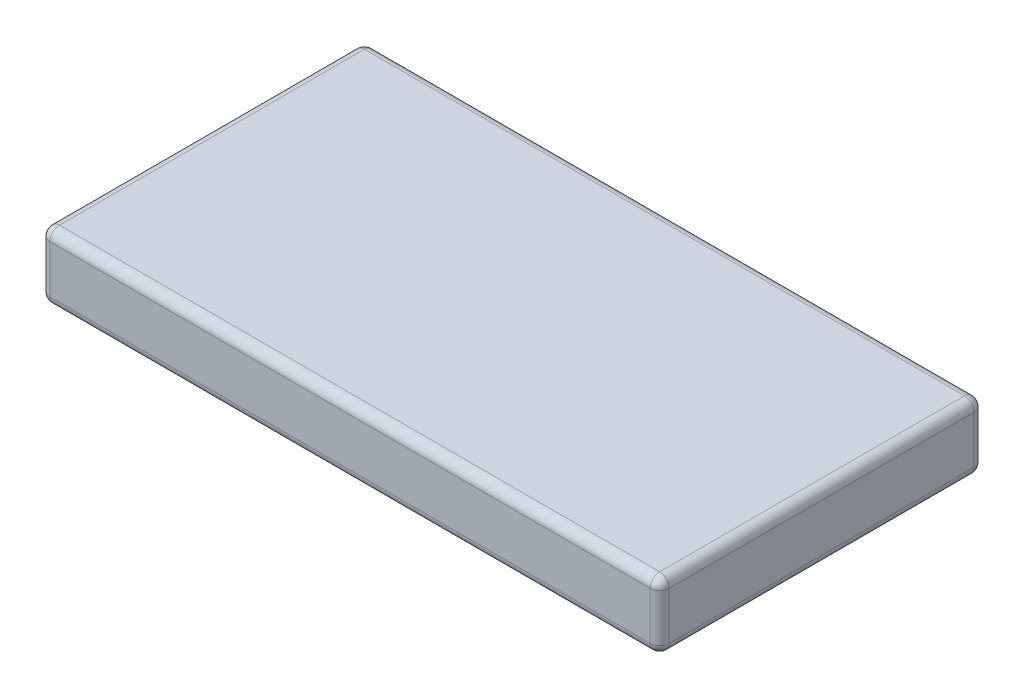
ISO-10303-21;
HEADER;
FILE_DESCRIPTION(('STEP AP214'),'2;1');
FILE_NAME('part.step','',(''),(''),'','','');
FILE_SCHEMA(('AUTOMOTIVE_DESIGN { 1 0 10303 214 1 1 1 1 }'));
ENDSEC;
DATA;
#1=APPLICATION_CONTEXT('core data for automotive mechanical design processes');
#2=APPLICATION_PROTOCOL_DEFINITION('international standard','automotive_design',2000,#1);
#3=PRODUCT_CONTEXT('',#1,'mechanical');
#4=PRODUCT('Part','Part','',(#3));
#5=PRODUCT_RELATED_PRODUCT_CATEGORY('part','',(#4));
#6=PRODUCT_DEFINITION_FORMATION('','',#4);
#7=PRODUCT_DEFINITION_CONTEXT('part definition',#1,'design');
#8=PRODUCT_DEFINITION('design','',#6,#7);
#9=PRODUCT_DEFINITION_SHAPE('','',#8);
#10=(LENGTH_UNIT() NAMED_UNIT(*) SI_UNIT(.MILLI.,.METRE.));
#11=(NAMED_UNIT(*) PLANE_ANGLE_UNIT() SI_UNIT($,.RADIAN.));
#12=(NAMED_UNIT(*) SI_UNIT($,.STERADIAN.) SOLID_ANGLE_UNIT());
#13=UNCERTAINTY_MEASURE_WITH_UNIT(LENGTH_MEASURE(1.E-05),#10,'distance_accuracy_value','');
#14=(GEOMETRIC_REPRESENTATION_CONTEXT(3) GLOBAL_UNCERTAINTY_ASSIGNED_CONTEXT((#13)) GLOBAL_UNIT_ASSIGNED_CONTEXT((#10,
#11,#12)) REPRESENTATION_CONTEXT('',''));
#15=CARTESIAN_POINT('',(0.,0.,0.));
#16=DIRECTION('',(0.,0.,1.));
#17=DIRECTION('',(1.,0.,0.));
#18=AXIS2_PLACEMENT_3D('',#15,#16,#17);
#19=CARTESIAN_POINT('',(32.5,7.,-17.));
#20=DIRECTION('',(-1.,0.,0.));
#21=DIRECTION('',(0.,0.,1.));
#22=AXIS2_PLACEMENT_3D('',#19,#20,#21);
#23=PLANE('',#22);
#24=DIRECTION('',(0.,0.,-1.));
#25=VECTOR('',#24,1.);
#26=CARTESIAN_POINT('',(32.5,1.,-17.));
#27=LINE('',#26,#25);
#28=CARTESIAN_POINT('',(32.5,1.,16.));
#29=VERTEX_POINT('',#28);
#30=CARTESIAN_POINT('',(32.5,1.,-16.));
#31=VERTEX_POINT('',#30);
#32=EDGE_CURVE('E168',#29,#31,#27,.T.);
#33=ORIENTED_EDGE('',*,*,#32,.T.);
#34=DIRECTION('',(0.,-1.,0.));
#35=VECTOR('',#34,1.);
#36=CARTESIAN_POINT('',(32.5,7.,-16.));
#37=LINE('',#36,#35);
#38=CARTESIAN_POINT('',(32.5,6.,-16.));
#39=VERTEX_POINT('',#38);
#40=EDGE_CURVE('E174',#31,#39,#37,.F.);
#41=ORIENTED_EDGE('',*,*,#40,.T.);
#42=DIRECTION('',(0.,0.,-1.));
#43=VECTOR('',#42,1.);
#44=CARTESIAN_POINT('',(32.5,6.,17.));
#45=LINE('',#44,#43);
#46=CARTESIAN_POINT('',(32.5,6.,16.));
#47=VERTEX_POINT('',#46);
#48=EDGE_CURVE('E172',#39,#47,#45,.F.);
#49=ORIENTED_EDGE('',*,*,#48,.T.);
#50=DIRECTION('',(0.,-1.,0.));
#51=VECTOR('',#50,1.);
#52=CARTESIAN_POINT('',(32.5,7.,16.));
#53=LINE('',#52,#51);
#54=EDGE_CURVE('E170',#47,#29,#53,.T.);
#55=ORIENTED_EDGE('',*,*,#54,.T.);
#56=EDGE_LOOP('',(#33,#41,#49,#55));
#57=FACE_BOUND('',#56,.T.);
#58=ADVANCED_FACE('F34',(#57),#23,.F.);
#59=CARTESIAN_POINT('',(-32.5,7.,-17.));
#60=DIRECTION('',(0.,0.,1.));
#61=DIRECTION('',(1.,0.,0.));
#62=AXIS2_PLACEMENT_3D('',#59,#60,#61);
#63=PLANE('',#62);
#64=DIRECTION('',(0.,-1.,0.));
#65=VECTOR('',#64,1.);
#66=CARTESIAN_POINT('',(-31.5,7.,-17.));
#67=LINE('',#66,#65);
#68=CARTESIAN_POINT('',(-31.5,1.,-17.));
#69=VERTEX_POINT('',#68);
#70=CARTESIAN_POINT('',(-31.5,6.,-17.));
#71=VERTEX_POINT('',#70);
#72=EDGE_CURVE('E130',#69,#71,#67,.F.);
#73=ORIENTED_EDGE('',*,*,#72,.T.);
#74=DIRECTION('',(-1.,0.,0.));
#75=VECTOR('',#74,1.);
#76=CARTESIAN_POINT('',(32.5,6.,-17.));
#77=LINE('',#76,#75);
#78=CARTESIAN_POINT('',(31.5,6.,-17.));
#79=VERTEX_POINT('',#78);
#80=EDGE_CURVE('E166',#71,#79,#77,.F.);
#81=ORIENTED_EDGE('',*,*,#80,.T.);
#82=DIRECTION('',(0.,-1.,0.));
#83=VECTOR('',#82,1.);
#84=CARTESIAN_POINT('',(31.5,7.,-17.));
#85=LINE('',#84,#83);
#86=CARTESIAN_POINT('',(31.5,1.,-17.));
#87=VERTEX_POINT('',#86);
#88=EDGE_CURVE('E159',#79,#87,#85,.T.);
#89=ORIENTED_EDGE('',*,*,#88,.T.);
#90=DIRECTION('',(-1.,0.,0.));
#91=VECTOR('',#90,1.);
#92=CARTESIAN_POINT('',(-32.5,1.,-17.));
#93=LINE('',#92,#91);
#94=EDGE_CURVE('E157',#87,#69,#93,.T.);
#95=ORIENTED_EDGE('',*,*,#94,.T.);
#96=EDGE_LOOP('',(#73,#81,#89,#95));
#97=FACE_BOUND('',#96,.T.);
#98=ADVANCED_FACE('F331',(#97),#63,.F.);
#99=CARTESIAN_POINT('',(-32.5,7.,-17.));
#100=DIRECTION('',(1.,0.,0.));
#101=DIRECTION('',(0.,0.,-1.));
#102=AXIS2_PLACEMENT_3D('',#99,#100,#101);
#103=PLANE('',#102);
#104=DIRECTION('',(0.,0.,1.));
#105=VECTOR('',#104,1.);
#106=CARTESIAN_POINT('',(-32.5,6.,-17.));
#107=LINE('',#106,#105);
#108=CARTESIAN_POINT('',(-32.5,6.,16.));
#109=VERTEX_POINT('',#108);
#110=CARTESIAN_POINT('',(-32.5,6.,-16.));
#111=VERTEX_POINT('',#110);
#112=EDGE_CURVE('E155',#109,#111,#107,.F.);
#113=ORIENTED_EDGE('',*,*,#112,.T.);
#114=DIRECTION('',(0.,-1.,0.));
#115=VECTOR('',#114,1.);
#116=CARTESIAN_POINT('',(-32.5,7.,-16.));
#117=LINE('',#116,#115);
#118=CARTESIAN_POINT('',(-32.5,1.,-16.));
#119=VERTEX_POINT('',#118);
#120=EDGE_CURVE('E128',#111,#119,#117,.T.);
#121=ORIENTED_EDGE('',*,*,#120,.T.);
#122=DIRECTION('',(0.,0.,1.));
#123=VECTOR('',#122,1.);
#124=CARTESIAN_POINT('',(-32.5,1.,-17.));
#125=LINE('',#124,#123);
#126=CARTESIAN_POINT('',(-32.5,1.,16.));
#127=VERTEX_POINT('',#126);
#128=EDGE_CURVE('E145',#119,#127,#125,.T.);
#129=ORIENTED_EDGE('',*,*,#128,.T.);
#130=DIRECTION('',(0.,-1.,0.));
#131=VECTOR('',#130,1.);
#132=CARTESIAN_POINT('',(-32.5,7.,16.));
#133=LINE('',#132,#131);
#134=EDGE_CURVE('E151',#127,#109,#133,.F.);
#135=ORIENTED_EDGE('',*,*,#134,.T.);
#136=EDGE_LOOP('',(#113,#121,#129,#135));
#137=FACE_BOUND('',#136,.T.);
#138=ADVANCED_FACE('F153',(#137),#103,.F.);
#139=CARTESIAN_POINT('',(-32.5,7.,17.));
#140=DIRECTION('',(0.,0.,-1.));
#141=DIRECTION('',(-1.,0.,0.));
#142=AXIS2_PLACEMENT_3D('',#139,#140,#141);
#143=PLANE('',#142);
#144=DIRECTION('',(1.,0.,0.));
#145=VECTOR('',#144,1.);
#146=CARTESIAN_POINT('',(-32.5,6.,17.));
#147=LINE('',#146,#145);
#148=CARTESIAN_POINT('',(31.5,6.,17.));
#149=VERTEX_POINT('',#148);
#150=CARTESIAN_POINT('',(-31.5,6.,17.));
#151=VERTEX_POINT('',#150);
#152=EDGE_CURVE('E192',#149,#151,#147,.F.);
#153=ORIENTED_EDGE('',*,*,#152,.T.);
#154=DIRECTION('',(0.,-1.,0.));
#155=VECTOR('',#154,1.);
#156=CARTESIAN_POINT('',(-31.5,7.,17.));
#157=LINE('',#156,#155);
#158=CARTESIAN_POINT('',(-31.5,1.,17.));
#159=VERTEX_POINT('',#158);
#160=EDGE_CURVE('E195',#151,#159,#157,.T.);
#161=ORIENTED_EDGE('',*,*,#160,.T.);
#162=DIRECTION('',(1.,0.,0.));
#163=VECTOR('',#162,1.);
#164=CARTESIAN_POINT('',(-32.5,1.,17.));
#165=LINE('',#164,#163);
#166=CARTESIAN_POINT('',(31.5,1.,17.));
#167=VERTEX_POINT('',#166);
#168=EDGE_CURVE('E187',#159,#167,#165,.T.);
#169=ORIENTED_EDGE('',*,*,#168,.T.);
#170=DIRECTION('',(0.,-1.,0.));
#171=VECTOR('',#170,1.);
#172=CARTESIAN_POINT('',(31.5,7.,17.));
#173=LINE('',#172,#171);
#174=EDGE_CURVE('E190',#167,#149,#173,.F.);
#175=ORIENTED_EDGE('',*,*,#174,.T.);
#176=EDGE_LOOP('',(#153,#161,#169,#175));
#177=FACE_BOUND('',#176,.T.);
#178=ADVANCED_FACE('F283',(#177),#143,.F.);
#179=CARTESIAN_POINT('',(0.,7.,0.));
#180=DIRECTION('',(0.,1.,0.));
#181=DIRECTION('',(0.,0.,1.));
#182=AXIS2_PLACEMENT_3D('',#179,#180,#181);
#183=PLANE('',#182);
#184=DIRECTION('',(-1.,0.,0.));
#185=VECTOR('',#184,1.);
#186=CARTESIAN_POINT('',(-32.5,7.,-16.));
#187=LINE('',#186,#185);
#188=CARTESIAN_POINT('',(31.5,7.,-16.));
#189=VERTEX_POINT('',#188);
#190=CARTESIAN_POINT('',(-31.5,7.,-16.));
#191=VERTEX_POINT('',#190);
#192=EDGE_CURVE('E182',#189,#191,#187,.T.);
#193=ORIENTED_EDGE('',*,*,#192,.T.);
#194=DIRECTION('',(0.,0.,1.));
#195=VECTOR('',#194,1.);
#196=CARTESIAN_POINT('',(-31.5,7.,17.));
#197=LINE('',#196,#195);
#198=CARTESIAN_POINT('',(-31.5,7.,16.));
#199=VERTEX_POINT('',#198);
#200=EDGE_CURVE('E184',#191,#199,#197,.T.);
#201=ORIENTED_EDGE('',*,*,#200,.T.);
#202=DIRECTION('',(1.,0.,0.));
#203=VECTOR('',#202,1.);
#204=CARTESIAN_POINT('',(32.5,7.,16.));
#205=LINE('',#204,#203);
#206=CARTESIAN_POINT('',(31.5,7.,16.));
#207=VERTEX_POINT('',#206);
#208=EDGE_CURVE('E177',#199,#207,#205,.T.);
#209=ORIENTED_EDGE('',*,*,#208,.T.);
#210=DIRECTION('',(0.,0.,-1.));
#211=VECTOR('',#210,1.);
#212=CARTESIAN_POINT('',(31.5,7.,-17.));
#213=LINE('',#212,#211);
#214=EDGE_CURVE('E180',#207,#189,#213,.T.);
#215=ORIENTED_EDGE('',*,*,#214,.T.);
#216=EDGE_LOOP('',(#193,#201,#209,#215));
#217=FACE_BOUND('',#216,.T.);
#218=ADVANCED_FACE('F274',(#217),#183,.T.);
#219=CARTESIAN_POINT('',(0.,0.,0.));
#220=DIRECTION('',(0.,1.,0.));
#221=DIRECTION('',(0.,0.,1.));
#222=AXIS2_PLACEMENT_3D('',#219,#220,#221);
#223=PLANE('',#222);
#224=DIRECTION('',(0.,0.,1.));
#225=VECTOR('',#224,1.);
#226=CARTESIAN_POINT('',(-31.5,0.,0.));
#227=LINE('',#226,#225);
#228=CARTESIAN_POINT('',(-31.5,0.,16.));
#229=VERTEX_POINT('',#228);
#230=CARTESIAN_POINT('',(-31.5,0.,-16.));
#231=VERTEX_POINT('',#230);
#232=EDGE_CURVE('E43',#229,#231,#227,.F.);
#233=ORIENTED_EDGE('',*,*,#232,.T.);
#234=DIRECTION('',(-1.,0.,0.));
#235=VECTOR('',#234,1.);
#236=CARTESIAN_POINT('',(0.,0.,-16.));
#237=LINE('',#236,#235);
#238=CARTESIAN_POINT('',(31.5,0.,-16.));
#239=VERTEX_POINT('',#238);
#240=EDGE_CURVE('E11',#231,#239,#237,.F.);
#241=ORIENTED_EDGE('',*,*,#240,.T.);
#242=DIRECTION('',(0.,0.,-1.));
#243=VECTOR('',#242,1.);
#244=CARTESIAN_POINT('',(31.5,0.,0.));
#245=LINE('',#244,#243);
#246=CARTESIAN_POINT('',(31.5,0.,16.));
#247=VERTEX_POINT('',#246);
#248=EDGE_CURVE('E198',#239,#247,#245,.F.);
#249=ORIENTED_EDGE('',*,*,#248,.T.);
#250=DIRECTION('',(1.,0.,0.));
#251=VECTOR('',#250,1.);
#252=CARTESIAN_POINT('',(0.,0.,16.));
#253=LINE('',#252,#251);
#254=EDGE_CURVE('E54',#247,#229,#253,.F.);
#255=ORIENTED_EDGE('',*,*,#254,.T.);
#256=EDGE_LOOP('',(#233,#241,#249,#255));
#257=FACE_BOUND('',#256,.T.);
#258=ADVANCED_FACE('F361',(#257),#223,.F.);
#259=CARTESIAN_POINT('',(31.5,7.,16.));
#260=DIRECTION('',(0.,-1.,0.));
#261=DIRECTION('',(0.,0.,-1.));
#262=AXIS2_PLACEMENT_3D('',#259,#260,#261);
#263=CYLINDRICAL_SURFACE('',#262,1.);
#264=CARTESIAN_POINT('',(31.5,6.,16.));
#265=DIRECTION('',(0.,1.,0.));
#266=DIRECTION('',(0.,0.,1.));
#267=AXIS2_PLACEMENT_3D('',#264,#265,#266);
#268=CIRCLE('',#267,1.);
#269=EDGE_CURVE('E38',#149,#47,#268,.T.);
#270=ORIENTED_EDGE('',*,*,#269,.F.);
#271=ORIENTED_EDGE('',*,*,#174,.F.);
#272=CARTESIAN_POINT('',(31.5,1.,16.));
#273=DIRECTION('',(0.,-1.,0.));
#274=DIRECTION('',(0.,0.,-1.));
#275=AXIS2_PLACEMENT_3D('',#272,#273,#274);
#276=CIRCLE('',#275,1.);
#277=EDGE_CURVE('E251',#29,#167,#276,.T.);
#278=ORIENTED_EDGE('',*,*,#277,.F.);
#279=ORIENTED_EDGE('',*,*,#54,.F.);
#280=EDGE_LOOP('',(#270,#271,#278,#279));
#281=FACE_BOUND('',#280,.T.);
#282=ADVANCED_FACE('F36',(#281),#263,.T.);
#283=CARTESIAN_POINT('',(31.5,6.,16.));
#284=DIRECTION('',(0.,0.,1.));
#285=DIRECTION('',(1.,0.,0.));
#286=AXIS2_PLACEMENT_3D('',#283,#284,#285);
#287=SPHERICAL_SURFACE('',#286,1.);
#288=CARTESIAN_POINT('',(31.5,6.,16.));
#289=DIRECTION('',(1.,0.,0.));
#290=DIRECTION('',(0.,0.,-1.));
#291=AXIS2_PLACEMENT_3D('',#288,#289,#290);
#292=CIRCLE('',#291,1.);
#293=EDGE_CURVE('E246',#149,#207,#292,.F.);
#294=ORIENTED_EDGE('',*,*,#293,.F.);
#295=ORIENTED_EDGE('',*,*,#269,.T.);
#296=CARTESIAN_POINT('',(31.5,6.,16.));
#297=DIRECTION('',(0.,0.,1.));
#298=DIRECTION('',(1.,0.,0.));
#299=AXIS2_PLACEMENT_3D('',#296,#297,#298);
#300=CIRCLE('',#299,1.);
#301=EDGE_CURVE('E249',#207,#47,#300,.F.);
#302=ORIENTED_EDGE('',*,*,#301,.F.);
#303=EDGE_LOOP('',(#294,#295,#302));
#304=FACE_BOUND('',#303,.T.);
#305=ADVANCED_FACE('F262',(#304),#287,.T.);
#306=CARTESIAN_POINT('',(31.5,1.,16.));
#307=DIRECTION('',(0.,0.,1.));
#308=DIRECTION('',(1.,0.,0.));
#309=AXIS2_PLACEMENT_3D('',#306,#307,#308);
#310=SPHERICAL_SURFACE('',#309,1.);
#311=CARTESIAN_POINT('',(31.5,1.,16.));
#312=DIRECTION('',(0.,0.,1.));
#313=DIRECTION('',(1.,0.,0.));
#314=AXIS2_PLACEMENT_3D('',#311,#312,#313);
#315=CIRCLE('',#314,1.);
#316=EDGE_CURVE('E240',#29,#247,#315,.F.);
#317=ORIENTED_EDGE('',*,*,#316,.F.);
#318=ORIENTED_EDGE('',*,*,#277,.T.);
#319=CARTESIAN_POINT('',(31.5,1.,16.));
#320=DIRECTION('',(1.,0.,0.));
#321=DIRECTION('',(0.,0.,-1.));
#322=AXIS2_PLACEMENT_3D('',#319,#320,#321);
#323=CIRCLE('',#322,1.);
#324=EDGE_CURVE('E243',#247,#167,#323,.F.);
#325=ORIENTED_EDGE('',*,*,#324,.F.);
#326=EDGE_LOOP('',(#317,#318,#325));
#327=FACE_BOUND('',#326,.T.);
#328=ADVANCED_FACE('F294',(#327),#310,.T.);
#329=CARTESIAN_POINT('',(31.5,6.,0.));
#330=DIRECTION('',(0.,0.,1.));
#331=DIRECTION('',(1.,0.,0.));
#332=AXIS2_PLACEMENT_3D('',#329,#330,#331);
#333=CYLINDRICAL_SURFACE('',#332,1.);
#334=ORIENTED_EDGE('',*,*,#301,.T.);
#335=ORIENTED_EDGE('',*,*,#48,.F.);
#336=CARTESIAN_POINT('',(31.5,6.,-16.));
#337=DIRECTION('',(0.,0.,-1.));
#338=DIRECTION('',(-1.,0.,0.));
#339=AXIS2_PLACEMENT_3D('',#336,#337,#338);
#340=CIRCLE('',#339,1.);
#341=EDGE_CURVE('E235',#189,#39,#340,.T.);
#342=ORIENTED_EDGE('',*,*,#341,.F.);
#343=ORIENTED_EDGE('',*,*,#214,.F.);
#344=EDGE_LOOP('',(#334,#335,#342,#343));
#345=FACE_BOUND('',#344,.T.);
#346=ADVANCED_FACE('F270',(#345),#333,.T.);
#347=CARTESIAN_POINT('',(0.,6.,16.));
#348=DIRECTION('',(-1.,0.,0.));
#349=DIRECTION('',(0.,0.,1.));
#350=AXIS2_PLACEMENT_3D('',#347,#348,#349);
#351=CYLINDRICAL_SURFACE('',#350,1.);
#352=ORIENTED_EDGE('',*,*,#293,.T.);
#353=ORIENTED_EDGE('',*,*,#208,.F.);
#354=CARTESIAN_POINT('',(-31.5,6.,16.));
#355=DIRECTION('',(-1.,0.,0.));
#356=DIRECTION('',(0.,0.,1.));
#357=AXIS2_PLACEMENT_3D('',#354,#355,#356);
#358=CIRCLE('',#357,1.);
#359=EDGE_CURVE('E232',#151,#199,#358,.T.);
#360=ORIENTED_EDGE('',*,*,#359,.F.);
#361=ORIENTED_EDGE('',*,*,#152,.F.);
#362=EDGE_LOOP('',(#352,#353,#360,#361));
#363=FACE_BOUND('',#362,.T.);
#364=ADVANCED_FACE('F280',(#363),#351,.T.);
#365=CARTESIAN_POINT('',(-31.5,7.,16.));
#366=DIRECTION('',(0.,-1.,0.));
#367=DIRECTION('',(0.,0.,-1.));
#368=AXIS2_PLACEMENT_3D('',#365,#366,#367);
#369=CYLINDRICAL_SURFACE('',#368,1.);
#370=CARTESIAN_POINT('',(-31.5,1.,16.));
#371=DIRECTION('',(0.,-1.,0.));
#372=DIRECTION('',(0.,0.,-1.));
#373=AXIS2_PLACEMENT_3D('',#370,#371,#372);
#374=CIRCLE('',#373,1.);
#375=EDGE_CURVE('E226',#159,#127,#374,.T.);
#376=ORIENTED_EDGE('',*,*,#375,.F.);
#377=ORIENTED_EDGE('',*,*,#160,.F.);
#378=CARTESIAN_POINT('',(-31.5,6.,16.));
#379=DIRECTION('',(0.,1.,0.));
#380=DIRECTION('',(0.,0.,1.));
#381=AXIS2_PLACEMENT_3D('',#378,#379,#380);
#382=CIRCLE('',#381,1.);
#383=EDGE_CURVE('E229',#109,#151,#382,.T.);
#384=ORIENTED_EDGE('',*,*,#383,.F.);
#385=ORIENTED_EDGE('',*,*,#134,.F.);
#386=EDGE_LOOP('',(#376,#377,#384,#385));
#387=FACE_BOUND('',#386,.T.);
#388=ADVANCED_FACE('F287',(#387),#369,.T.);
#389=CARTESIAN_POINT('',(-32.5,1.,16.));
#390=DIRECTION('',(1.,0.,0.));
#391=DIRECTION('',(0.,0.,-1.));
#392=AXIS2_PLACEMENT_3D('',#389,#390,#391);
#393=CYLINDRICAL_SURFACE('',#392,1.);
#394=ORIENTED_EDGE('',*,*,#324,.T.);
#395=ORIENTED_EDGE('',*,*,#168,.F.);
#396=CARTESIAN_POINT('',(-31.5,1.,16.));
#397=DIRECTION('',(-1.,0.,0.));
#398=DIRECTION('',(0.,0.,1.));
#399=AXIS2_PLACEMENT_3D('',#396,#397,#398);
#400=CIRCLE('',#399,1.);
#401=EDGE_CURVE('E224',#229,#159,#400,.T.);
#402=ORIENTED_EDGE('',*,*,#401,.F.);
#403=ORIENTED_EDGE('',*,*,#254,.F.);
#404=EDGE_LOOP('',(#394,#395,#402,#403));
#405=FACE_BOUND('',#404,.T.);
#406=ADVANCED_FACE('F292',(#405),#393,.T.);
#407=CARTESIAN_POINT('',(31.5,1.,-17.));
#408=DIRECTION('',(0.,0.,-1.));
#409=DIRECTION('',(-1.,0.,0.));
#410=AXIS2_PLACEMENT_3D('',#407,#408,#409);
#411=CYLINDRICAL_SURFACE('',#410,1.);
#412=ORIENTED_EDGE('',*,*,#316,.T.);
#413=ORIENTED_EDGE('',*,*,#248,.F.);
#414=CARTESIAN_POINT('',(31.5,1.,-16.));
#415=DIRECTION('',(0.,0.,-1.));
#416=DIRECTION('',(-1.,0.,0.));
#417=AXIS2_PLACEMENT_3D('',#414,#415,#416);
#418=CIRCLE('',#417,1.);
#419=EDGE_CURVE('E221',#31,#239,#418,.T.);
#420=ORIENTED_EDGE('',*,*,#419,.F.);
#421=ORIENTED_EDGE('',*,*,#32,.F.);
#422=EDGE_LOOP('',(#412,#413,#420,#421));
#423=FACE_BOUND('',#422,.T.);
#424=ADVANCED_FACE('F298',(#423),#411,.T.);
#425=CARTESIAN_POINT('',(31.5,7.,-16.));
#426=DIRECTION('',(0.,-1.,0.));
#427=DIRECTION('',(0.,0.,-1.));
#428=AXIS2_PLACEMENT_3D('',#425,#426,#427);
#429=CYLINDRICAL_SURFACE('',#428,1.);
#430=CARTESIAN_POINT('',(31.5,6.,-16.));
#431=DIRECTION('',(0.,1.,0.));
#432=DIRECTION('',(0.,0.,1.));
#433=AXIS2_PLACEMENT_3D('',#430,#431,#432);
#434=CIRCLE('',#433,1.);
#435=EDGE_CURVE('E237',#39,#79,#434,.T.);
#436=ORIENTED_EDGE('',*,*,#435,.F.);
#437=ORIENTED_EDGE('',*,*,#40,.F.);
#438=CARTESIAN_POINT('',(31.5,1.,-16.));
#439=DIRECTION('',(0.,-1.,0.));
#440=DIRECTION('',(0.,0.,-1.));
#441=AXIS2_PLACEMENT_3D('',#438,#439,#440);
#442=CIRCLE('',#441,1.);
#443=EDGE_CURVE('E218',#87,#31,#442,.T.);
#444=ORIENTED_EDGE('',*,*,#443,.F.);
#445=ORIENTED_EDGE('',*,*,#88,.F.);
#446=EDGE_LOOP('',(#436,#437,#444,#445));
#447=FACE_BOUND('',#446,.T.);
#448=ADVANCED_FACE('F304',(#447),#429,.T.);
#449=CARTESIAN_POINT('',(31.5,6.,-16.));
#450=DIRECTION('',(0.,0.,1.));
#451=DIRECTION('',(1.,0.,0.));
#452=AXIS2_PLACEMENT_3D('',#449,#450,#451);
#453=SPHERICAL_SURFACE('',#452,1.);
#454=ORIENTED_EDGE('',*,*,#341,.T.);
#455=ORIENTED_EDGE('',*,*,#435,.T.);
#456=CARTESIAN_POINT('',(31.5,6.,-16.));
#457=DIRECTION('',(1.,0.,0.));
#458=DIRECTION('',(0.,1.,0.));
#459=AXIS2_PLACEMENT_3D('',#456,#457,#458);
#460=CIRCLE('',#459,1.);
#461=EDGE_CURVE('E215',#189,#79,#460,.F.);
#462=ORIENTED_EDGE('',*,*,#461,.F.);
#463=EDGE_LOOP('',(#454,#455,#462));
#464=FACE_BOUND('',#463,.T.);
#465=ADVANCED_FACE('F308',(#464),#453,.T.);
#466=CARTESIAN_POINT('',(-31.5,6.,16.));
#467=DIRECTION('',(0.,0.,1.));
#468=DIRECTION('',(1.,0.,0.));
#469=AXIS2_PLACEMENT_3D('',#466,#467,#468);
#470=SPHERICAL_SURFACE('',#469,1.);
#471=ORIENTED_EDGE('',*,*,#383,.T.);
#472=ORIENTED_EDGE('',*,*,#359,.T.);
#473=CARTESIAN_POINT('',(-31.5,6.,16.));
#474=DIRECTION('',(0.,0.,1.));
#475=DIRECTION('',(1.,0.,0.));
#476=AXIS2_PLACEMENT_3D('',#473,#474,#475);
#477=CIRCLE('',#476,1.);
#478=EDGE_CURVE('E213',#109,#199,#477,.F.);
#479=ORIENTED_EDGE('',*,*,#478,.F.);
#480=EDGE_LOOP('',(#471,#472,#479));
#481=FACE_BOUND('',#480,.T.);
#482=ADVANCED_FACE('F319',(#481),#470,.T.);
#483=CARTESIAN_POINT('',(-31.5,1.,16.));
#484=DIRECTION('',(0.,0.,1.));
#485=DIRECTION('',(1.,0.,0.));
#486=AXIS2_PLACEMENT_3D('',#483,#484,#485);
#487=SPHERICAL_SURFACE('',#486,1.);
#488=ORIENTED_EDGE('',*,*,#401,.T.);
#489=ORIENTED_EDGE('',*,*,#375,.T.);
#490=CARTESIAN_POINT('',(-31.5,1.,16.));
#491=DIRECTION('',(0.,0.,1.));
#492=DIRECTION('',(1.,0.,0.));
#493=AXIS2_PLACEMENT_3D('',#490,#491,#492);
#494=CIRCLE('',#493,1.);
#495=EDGE_CURVE('E148',#229,#127,#494,.F.);
#496=ORIENTED_EDGE('',*,*,#495,.F.);
#497=EDGE_LOOP('',(#488,#489,#496));
#498=FACE_BOUND('',#497,.T.);
#499=ADVANCED_FACE('F321',(#498),#487,.T.);
#500=CARTESIAN_POINT('',(31.5,1.,-16.));
#501=DIRECTION('',(0.,0.,1.));
#502=DIRECTION('',(1.,0.,0.));
#503=AXIS2_PLACEMENT_3D('',#500,#501,#502);
#504=SPHERICAL_SURFACE('',#503,1.);
#505=ORIENTED_EDGE('',*,*,#443,.T.);
#506=ORIENTED_EDGE('',*,*,#419,.T.);
#507=CARTESIAN_POINT('',(31.5,1.,-16.));
#508=DIRECTION('',(1.,0.,0.));
#509=DIRECTION('',(0.,0.,-1.));
#510=AXIS2_PLACEMENT_3D('',#507,#508,#509);
#511=CIRCLE('',#510,1.);
#512=EDGE_CURVE('E210',#87,#239,#511,.F.);
#513=ORIENTED_EDGE('',*,*,#512,.F.);
#514=EDGE_LOOP('',(#505,#506,#513));
#515=FACE_BOUND('',#514,.T.);
#516=ADVANCED_FACE('F327',(#515),#504,.T.);
#517=CARTESIAN_POINT('',(0.,6.,-16.));
#518=DIRECTION('',(1.,0.,0.));
#519=DIRECTION('',(0.,0.,-1.));
#520=AXIS2_PLACEMENT_3D('',#517,#518,#519);
#521=CYLINDRICAL_SURFACE('',#520,1.);
#522=ORIENTED_EDGE('',*,*,#461,.T.);
#523=ORIENTED_EDGE('',*,*,#80,.F.);
#524=CARTESIAN_POINT('',(-31.5,6.,-16.));
#525=DIRECTION('',(-1.,0.,0.));
#526=DIRECTION('',(0.,0.,1.));
#527=AXIS2_PLACEMENT_3D('',#524,#525,#526);
#528=CIRCLE('',#527,1.);
#529=EDGE_CURVE('E207',#191,#71,#528,.T.);
#530=ORIENTED_EDGE('',*,*,#529,.F.);
#531=ORIENTED_EDGE('',*,*,#192,.F.);
#532=EDGE_LOOP('',(#522,#523,#530,#531));
#533=FACE_BOUND('',#532,.T.);
#534=ADVANCED_FACE('F311',(#533),#521,.T.);
#535=CARTESIAN_POINT('',(-31.5,6.,0.));
#536=DIRECTION('',(0.,0.,-1.));
#537=DIRECTION('',(-1.,0.,0.));
#538=AXIS2_PLACEMENT_3D('',#535,#536,#537);
#539=CYLINDRICAL_SURFACE('',#538,1.);
#540=ORIENTED_EDGE('',*,*,#478,.T.);
#541=ORIENTED_EDGE('',*,*,#200,.F.);
#542=CARTESIAN_POINT('',(-31.5,6.,-16.));
#543=DIRECTION('',(0.,0.,-1.));
#544=DIRECTION('',(-1.,0.,0.));
#545=AXIS2_PLACEMENT_3D('',#542,#543,#544);
#546=CIRCLE('',#545,1.);
#547=EDGE_CURVE('E142',#111,#191,#546,.T.);
#548=ORIENTED_EDGE('',*,*,#547,.F.);
#549=ORIENTED_EDGE('',*,*,#112,.F.);
#550=EDGE_LOOP('',(#540,#541,#548,#549));
#551=FACE_BOUND('',#550,.T.);
#552=ADVANCED_FACE('F317',(#551),#539,.T.);
#553=CARTESIAN_POINT('',(-31.5,1.,-17.));
#554=DIRECTION('',(0.,0.,1.));
#555=DIRECTION('',(1.,0.,0.));
#556=AXIS2_PLACEMENT_3D('',#553,#554,#555);
#557=CYLINDRICAL_SURFACE('',#556,1.);
#558=ORIENTED_EDGE('',*,*,#495,.T.);
#559=ORIENTED_EDGE('',*,*,#128,.F.);
#560=CARTESIAN_POINT('',(-31.5,1.,-16.));
#561=DIRECTION('',(0.,0.,-1.));
#562=DIRECTION('',(-1.,0.,0.));
#563=AXIS2_PLACEMENT_3D('',#560,#561,#562);
#564=CIRCLE('',#563,1.);
#565=EDGE_CURVE('E136',#231,#119,#564,.T.);
#566=ORIENTED_EDGE('',*,*,#565,.F.);
#567=ORIENTED_EDGE('',*,*,#232,.F.);
#568=EDGE_LOOP('',(#558,#559,#566,#567));
#569=FACE_BOUND('',#568,.T.);
#570=ADVANCED_FACE('F146',(#569),#557,.T.);
#571=CARTESIAN_POINT('',(-32.5,1.,-16.));
#572=DIRECTION('',(-1.,0.,0.));
#573=DIRECTION('',(0.,0.,1.));
#574=AXIS2_PLACEMENT_3D('',#571,#572,#573);
#575=CYLINDRICAL_SURFACE('',#574,1.);
#576=ORIENTED_EDGE('',*,*,#512,.T.);
#577=ORIENTED_EDGE('',*,*,#240,.F.);
#578=CARTESIAN_POINT('',(-31.5,1.,-16.));
#579=DIRECTION('',(-1.,0.,0.));
#580=DIRECTION('',(0.,0.,1.));
#581=AXIS2_PLACEMENT_3D('',#578,#579,#580);
#582=CIRCLE('',#581,1.);
#583=EDGE_CURVE('E140',#69,#231,#582,.T.);
#584=ORIENTED_EDGE('',*,*,#583,.F.);
#585=ORIENTED_EDGE('',*,*,#94,.F.);
#586=EDGE_LOOP('',(#576,#577,#584,#585));
#587=FACE_BOUND('',#586,.T.);
#588=ADVANCED_FACE('F346',(#587),#575,.T.);
#589=CARTESIAN_POINT('',(-31.5,6.,-16.));
#590=DIRECTION('',(0.,0.,1.));
#591=DIRECTION('',(1.,0.,0.));
#592=AXIS2_PLACEMENT_3D('',#589,#590,#591);
#593=SPHERICAL_SURFACE('',#592,1.);
#594=ORIENTED_EDGE('',*,*,#547,.T.);
#595=ORIENTED_EDGE('',*,*,#529,.T.);
#596=CARTESIAN_POINT('',(-31.5,6.,-16.));
#597=DIRECTION('',(0.,1.,0.));
#598=DIRECTION('',(0.,0.,1.));
#599=AXIS2_PLACEMENT_3D('',#596,#597,#598);
#600=CIRCLE('',#599,1.);
#601=EDGE_CURVE('E133',#111,#71,#600,.F.);
#602=ORIENTED_EDGE('',*,*,#601,.F.);
#603=EDGE_LOOP('',(#594,#595,#602));
#604=FACE_BOUND('',#603,.T.);
#605=ADVANCED_FACE('F315',(#604),#593,.T.);
#606=CARTESIAN_POINT('',(-31.5,1.,-16.));
#607=DIRECTION('',(0.,0.,1.));
#608=DIRECTION('',(1.,0.,0.));
#609=AXIS2_PLACEMENT_3D('',#606,#607,#608);
#610=SPHERICAL_SURFACE('',#609,1.);
#611=ORIENTED_EDGE('',*,*,#583,.T.);
#612=ORIENTED_EDGE('',*,*,#565,.T.);
#613=CARTESIAN_POINT('',(-31.5,1.,-16.));
#614=DIRECTION('',(0.,-1.,0.));
#615=DIRECTION('',(0.,0.,-1.));
#616=AXIS2_PLACEMENT_3D('',#613,#614,#615);
#617=CIRCLE('',#616,1.);
#618=EDGE_CURVE('E124',#69,#119,#617,.F.);
#619=ORIENTED_EDGE('',*,*,#618,.F.);
#620=EDGE_LOOP('',(#611,#612,#619));
#621=FACE_BOUND('',#620,.T.);
#622=ADVANCED_FACE('F138',(#621),#610,.T.);
#623=CARTESIAN_POINT('',(-31.5,7.,-16.));
#624=DIRECTION('',(0.,-1.,0.));
#625=DIRECTION('',(0.,0.,-1.));
#626=AXIS2_PLACEMENT_3D('',#623,#624,#625);
#627=CYLINDRICAL_SURFACE('',#626,1.);
#628=ORIENTED_EDGE('',*,*,#601,.T.);
#629=ORIENTED_EDGE('',*,*,#72,.F.);
#630=ORIENTED_EDGE('',*,*,#618,.T.);
#631=ORIENTED_EDGE('',*,*,#120,.F.);
#632=EDGE_LOOP('',(#628,#629,#630,#631));
#633=FACE_BOUND('',#632,.T.);
#634=ADVANCED_FACE('F126',(#633),#627,.T.);
#635=CLOSED_SHELL('',(#58,#98,#138,#178,#218,#258,#282,#305,#328,#346,#364,#388,#406,#424,#448,
#465,#482,#499,#516,#534,#552,#570,#588,#605,#622,#634));
#636=MANIFOLD_SOLID_BREP('B2',#635);
#637=ADVANCED_BREP_SHAPE_REPRESENTATION('',(#18,#636),#14);
#638=SHAPE_DEFINITION_REPRESENTATION(#9,#637);
ENDSEC;
END-ISO-10303-21;
